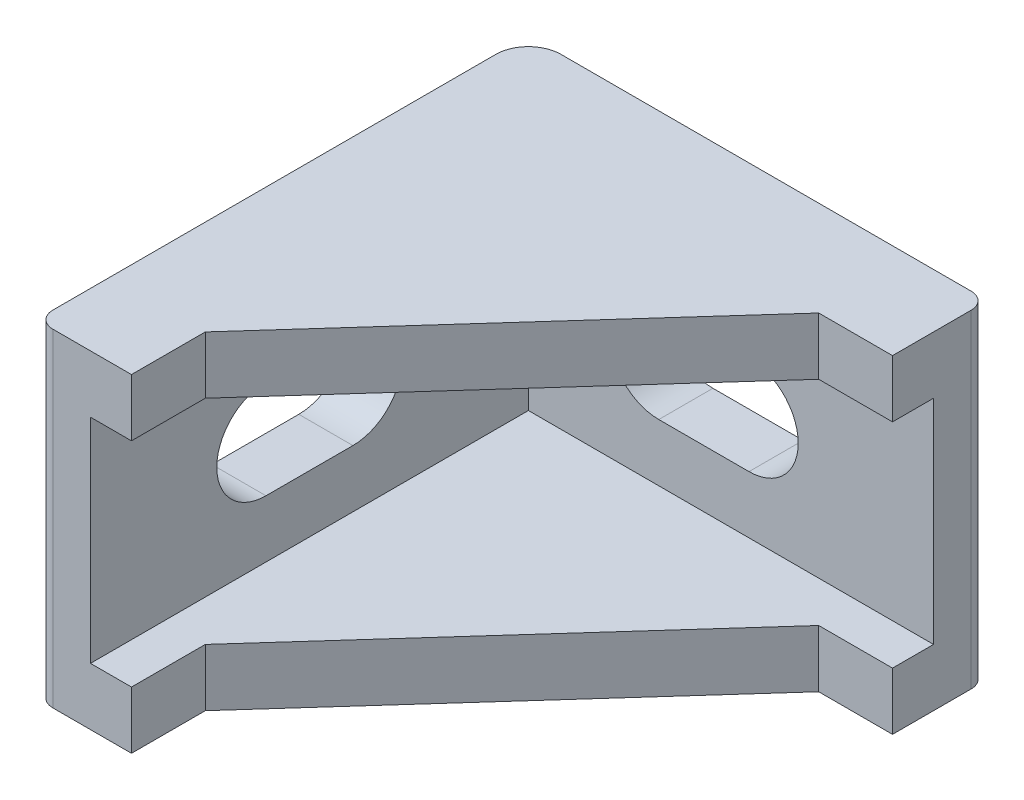
ISO-10303-21;
HEADER;
FILE_DESCRIPTION(('STEP AP214'),'2;1');
FILE_NAME('part.step','',(''),(''),'','','');
FILE_SCHEMA(('AUTOMOTIVE_DESIGN { 1 0 10303 214 1 1 1 1 }'));
ENDSEC;
DATA;
#1=APPLICATION_CONTEXT('core data for automotive mechanical design processes');
#2=APPLICATION_PROTOCOL_DEFINITION('international standard','automotive_design',2000,#1);
#3=PRODUCT_CONTEXT('',#1,'mechanical');
#4=PRODUCT('Part','Part','',(#3));
#5=PRODUCT_RELATED_PRODUCT_CATEGORY('part','',(#4));
#6=PRODUCT_DEFINITION_FORMATION('','',#4);
#7=PRODUCT_DEFINITION_CONTEXT('part definition',#1,'design');
#8=PRODUCT_DEFINITION('design','',#6,#7);
#9=PRODUCT_DEFINITION_SHAPE('','',#8);
#10=(LENGTH_UNIT() NAMED_UNIT(*) SI_UNIT(.MILLI.,.METRE.));
#11=(NAMED_UNIT(*) PLANE_ANGLE_UNIT() SI_UNIT($,.RADIAN.));
#12=(NAMED_UNIT(*) SI_UNIT($,.STERADIAN.) SOLID_ANGLE_UNIT());
#13=UNCERTAINTY_MEASURE_WITH_UNIT(LENGTH_MEASURE(1.E-05),#10,'distance_accuracy_value','');
#14=(GEOMETRIC_REPRESENTATION_CONTEXT(3) GLOBAL_UNCERTAINTY_ASSIGNED_CONTEXT((#13)) GLOBAL_UNIT_ASSIGNED_CONTEXT((#10,
#11,#12)) REPRESENTATION_CONTEXT('',''));
#15=CARTESIAN_POINT('',(0.,0.,0.));
#16=DIRECTION('',(0.,0.,1.));
#17=DIRECTION('',(1.,0.,0.));
#18=AXIS2_PLACEMENT_3D('',#15,#16,#17);
#19=CARTESIAN_POINT('',(0.,0.,3.3));
#20=DIRECTION('',(0.,0.,-1.));
#21=DIRECTION('',(-1.,0.,0.));
#22=AXIS2_PLACEMENT_3D('',#19,#20,#21);
#23=PLANE('',#22);
#24=CARTESIAN_POINT('',(11.25,10.,3.3));
#25=DIRECTION('',(0.,0.,1.));
#26=DIRECTION('',(1.,0.,0.));
#27=AXIS2_PLACEMENT_3D('',#24,#25,#26);
#28=CIRCLE('',#27,3.);
#29=CARTESIAN_POINT('',(11.25,13.,3.3));
#30=VERTEX_POINT('',#29);
#31=CARTESIAN_POINT('',(11.25,7.,3.3));
#32=VERTEX_POINT('',#31);
#33=EDGE_CURVE('E253',#30,#32,#28,.T.);
#34=ORIENTED_EDGE('',*,*,#33,.F.);
#35=DIRECTION('',(-1.,0.,0.));
#36=VECTOR('',#35,1.);
#37=CARTESIAN_POINT('',(11.25,13.,3.3));
#38=LINE('',#37,#36);
#39=CARTESIAN_POINT('',(16.75,13.,3.3));
#40=VERTEX_POINT('',#39);
#41=EDGE_CURVE('E264',#40,#30,#38,.T.);
#42=ORIENTED_EDGE('',*,*,#41,.F.);
#43=CARTESIAN_POINT('',(16.75,10.,3.3));
#44=DIRECTION('',(0.,0.,1.));
#45=DIRECTION('',(1.,0.,0.));
#46=AXIS2_PLACEMENT_3D('',#43,#44,#45);
#47=CIRCLE('',#46,3.);
#48=CARTESIAN_POINT('',(16.75,7.,3.3));
#49=VERTEX_POINT('',#48);
#50=EDGE_CURVE('E260',#49,#40,#47,.T.);
#51=ORIENTED_EDGE('',*,*,#50,.F.);
#52=DIRECTION('',(1.,0.,0.));
#53=VECTOR('',#52,1.);
#54=CARTESIAN_POINT('',(11.25,7.,3.3));
#55=LINE('',#54,#53);
#56=EDGE_CURVE('E256',#32,#49,#55,.T.);
#57=ORIENTED_EDGE('',*,*,#56,.F.);
#58=EDGE_LOOP('',(#34,#42,#51,#57));
#59=FACE_BOUND('',#58,.T.);
#60=DIRECTION('',(0.,1.,0.));
#61=VECTOR('',#60,1.);
#62=CARTESIAN_POINT('',(28.,0.,3.3));
#63=LINE('',#62,#61);
#64=CARTESIAN_POINT('',(28.,3.5,3.3));
#65=VERTEX_POINT('',#64);
#66=CARTESIAN_POINT('',(28.,16.5,3.3));
#67=VERTEX_POINT('',#66);
#68=EDGE_CURVE('E231',#65,#67,#63,.T.);
#69=ORIENTED_EDGE('',*,*,#68,.T.);
#70=DIRECTION('',(-1.,0.,0.));
#71=VECTOR('',#70,1.);
#72=CARTESIAN_POINT('',(3.29999999999999,16.5,3.3));
#73=LINE('',#72,#71);
#74=CARTESIAN_POINT('',(3.29999999999999,16.5,3.3));
#75=VERTEX_POINT('',#74);
#76=EDGE_CURVE('E214',#67,#75,#73,.T.);
#77=ORIENTED_EDGE('',*,*,#76,.T.);
#78=DIRECTION('',(0.,1.,0.));
#79=VECTOR('',#78,1.);
#80=CARTESIAN_POINT('',(3.29999999999999,20.,3.3));
#81=LINE('',#80,#79);
#82=CARTESIAN_POINT('',(3.29999999999999,3.5,3.3));
#83=VERTEX_POINT('',#82);
#84=EDGE_CURVE('E229',#83,#75,#81,.T.);
#85=ORIENTED_EDGE('',*,*,#84,.F.);
#86=DIRECTION('',(1.,0.,0.));
#87=VECTOR('',#86,1.);
#88=CARTESIAN_POINT('',(3.29999999999999,3.5,3.3));
#89=LINE('',#88,#87);
#90=EDGE_CURVE('E442',#83,#65,#89,.T.);
#91=ORIENTED_EDGE('',*,*,#90,.T.);
#92=EDGE_LOOP('',(#69,#77,#85,#91));
#93=FACE_BOUND('',#92,.T.);
#94=ADVANCED_FACE('F44',(#59,#93),#23,.F.);
#95=CARTESIAN_POINT('',(3.29999999999999,20.,30.));
#96=DIRECTION('',(-1.,0.,0.));
#97=DIRECTION('',(0.,-1.,0.));
#98=AXIS2_PLACEMENT_3D('',#95,#96,#97);
#99=PLANE('',#98);
#100=DIRECTION('',(0.,0.,-1.));
#101=VECTOR('',#100,1.);
#102=CARTESIAN_POINT('',(3.29999999999999,7.,19.3));
#103=LINE('',#102,#101);
#104=CARTESIAN_POINT('',(3.29999999999999,7.,19.3));
#105=VERTEX_POINT('',#104);
#106=CARTESIAN_POINT('',(3.29999999999999,7.,14.));
#107=VERTEX_POINT('',#106);
#108=EDGE_CURVE('E375',#105,#107,#103,.T.);
#109=ORIENTED_EDGE('',*,*,#108,.F.);
#110=CARTESIAN_POINT('',(3.29999999999999,10.,19.3));
#111=DIRECTION('',(1.,0.,0.));
#112=DIRECTION('',(0.,1.,0.));
#113=AXIS2_PLACEMENT_3D('',#110,#111,#112);
#114=CIRCLE('',#113,3.);
#115=CARTESIAN_POINT('',(3.29999999999999,13.,19.3));
#116=VERTEX_POINT('',#115);
#117=EDGE_CURVE('E379',#116,#105,#114,.T.);
#118=ORIENTED_EDGE('',*,*,#117,.F.);
#119=DIRECTION('',(0.,0.,1.));
#120=VECTOR('',#119,1.);
#121=CARTESIAN_POINT('',(3.29999999999999,13.,19.3));
#122=LINE('',#121,#120);
#123=CARTESIAN_POINT('',(3.29999999999999,13.,14.));
#124=VERTEX_POINT('',#123);
#125=EDGE_CURVE('E366',#124,#116,#122,.T.);
#126=ORIENTED_EDGE('',*,*,#125,.F.);
#127=CARTESIAN_POINT('',(3.29999999999999,10.,14.));
#128=DIRECTION('',(1.,0.,0.));
#129=DIRECTION('',(0.,1.,0.));
#130=AXIS2_PLACEMENT_3D('',#127,#128,#129);
#131=CIRCLE('',#130,3.);
#132=EDGE_CURVE('E371',#107,#124,#131,.T.);
#133=ORIENTED_EDGE('',*,*,#132,.F.);
#134=EDGE_LOOP('',(#109,#118,#126,#133));
#135=FACE_BOUND('',#134,.T.);
#136=ORIENTED_EDGE('',*,*,#84,.T.);
#137=DIRECTION('',(0.,0.,1.));
#138=VECTOR('',#137,1.);
#139=CARTESIAN_POINT('',(3.29999999999999,16.5,30.));
#140=LINE('',#139,#138);
#141=CARTESIAN_POINT('',(3.29999999999999,16.5,30.));
#142=VERTEX_POINT('',#141);
#143=EDGE_CURVE('E210',#75,#142,#140,.T.);
#144=ORIENTED_EDGE('',*,*,#143,.T.);
#145=DIRECTION('',(0.,1.,0.));
#146=VECTOR('',#145,1.);
#147=CARTESIAN_POINT('',(3.29999999999999,20.,30.));
#148=LINE('',#147,#146);
#149=CARTESIAN_POINT('',(3.3,3.5,30.));
#150=VERTEX_POINT('',#149);
#151=EDGE_CURVE('E245',#150,#142,#148,.T.);
#152=ORIENTED_EDGE('',*,*,#151,.F.);
#153=DIRECTION('',(0.,0.,-1.));
#154=VECTOR('',#153,1.);
#155=CARTESIAN_POINT('',(3.3,3.5,30.));
#156=LINE('',#155,#154);
#157=EDGE_CURVE('E238',#150,#83,#156,.T.);
#158=ORIENTED_EDGE('',*,*,#157,.T.);
#159=EDGE_LOOP('',(#136,#144,#152,#158));
#160=FACE_BOUND('',#159,.T.);
#161=ADVANCED_FACE('F236',(#135,#160),#99,.F.);
#162=CARTESIAN_POINT('',(0.,0.,0.));
#163=DIRECTION('',(0.,0.,-1.));
#164=DIRECTION('',(-1.,0.,0.));
#165=AXIS2_PLACEMENT_3D('',#162,#163,#164);
#166=PLANE('',#165);
#167=DIRECTION('',(-1.,0.,0.));
#168=VECTOR('',#167,1.);
#169=CARTESIAN_POINT('',(0.,20.,0.));
#170=LINE('',#169,#168);
#171=CARTESIAN_POINT('',(27.,20.,0.));
#172=VERTEX_POINT('',#171);
#173=CARTESIAN_POINT('',(1.99999999999999,20.,0.));
#174=VERTEX_POINT('',#173);
#175=EDGE_CURVE('E300',#172,#174,#170,.T.);
#176=ORIENTED_EDGE('',*,*,#175,.F.);
#177=DIRECTION('',(0.,1.,0.));
#178=VECTOR('',#177,1.);
#179=CARTESIAN_POINT('',(27.,0.,0.));
#180=LINE('',#179,#178);
#181=CARTESIAN_POINT('',(27.,0.,0.));
#182=VERTEX_POINT('',#181);
#183=EDGE_CURVE('E53',#172,#182,#180,.F.);
#184=ORIENTED_EDGE('',*,*,#183,.T.);
#185=DIRECTION('',(1.,0.,0.));
#186=VECTOR('',#185,1.);
#187=CARTESIAN_POINT('',(0.,0.,0.));
#188=LINE('',#187,#186);
#189=CARTESIAN_POINT('',(2.,0.,0.));
#190=VERTEX_POINT('',#189);
#191=EDGE_CURVE('E296',#190,#182,#188,.T.);
#192=ORIENTED_EDGE('',*,*,#191,.F.);
#193=DIRECTION('',(0.,-1.,0.));
#194=VECTOR('',#193,1.);
#195=CARTESIAN_POINT('',(1.99999999999999,20.,0.));
#196=LINE('',#195,#194);
#197=EDGE_CURVE('E324',#190,#174,#196,.F.);
#198=ORIENTED_EDGE('',*,*,#197,.T.);
#199=EDGE_LOOP('',(#176,#184,#192,#198));
#200=FACE_BOUND('',#199,.T.);
#201=DIRECTION('',(-1.,0.,0.));
#202=VECTOR('',#201,1.);
#203=CARTESIAN_POINT('',(11.25,13.,0.));
#204=LINE('',#203,#202);
#205=CARTESIAN_POINT('',(16.75,13.,0.));
#206=VERTEX_POINT('',#205);
#207=CARTESIAN_POINT('',(11.25,13.,0.));
#208=VERTEX_POINT('',#207);
#209=EDGE_CURVE('E257',#206,#208,#204,.T.);
#210=ORIENTED_EDGE('',*,*,#209,.T.);
#211=CARTESIAN_POINT('',(11.25,10.,0.));
#212=DIRECTION('',(0.,0.,1.));
#213=DIRECTION('',(1.,0.,0.));
#214=AXIS2_PLACEMENT_3D('',#211,#212,#213);
#215=CIRCLE('',#214,3.);
#216=CARTESIAN_POINT('',(11.25,7.,0.));
#217=VERTEX_POINT('',#216);
#218=EDGE_CURVE('E268',#208,#217,#215,.T.);
#219=ORIENTED_EDGE('',*,*,#218,.T.);
#220=DIRECTION('',(1.,0.,0.));
#221=VECTOR('',#220,1.);
#222=CARTESIAN_POINT('',(11.25,7.,0.));
#223=LINE('',#222,#221);
#224=CARTESIAN_POINT('',(16.75,7.,0.));
#225=VERTEX_POINT('',#224);
#226=EDGE_CURVE('E272',#217,#225,#223,.T.);
#227=ORIENTED_EDGE('',*,*,#226,.T.);
#228=CARTESIAN_POINT('',(16.75,10.,0.));
#229=DIRECTION('',(0.,0.,1.));
#230=DIRECTION('',(1.,0.,0.));
#231=AXIS2_PLACEMENT_3D('',#228,#229,#230);
#232=CIRCLE('',#231,3.);
#233=EDGE_CURVE('E276',#225,#206,#232,.T.);
#234=ORIENTED_EDGE('',*,*,#233,.T.);
#235=EDGE_LOOP('',(#210,#219,#227,#234));
#236=FACE_BOUND('',#235,.T.);
#237=ADVANCED_FACE('F526',(#200,#236),#166,.T.);
#238=CARTESIAN_POINT('',(0.,0.,3.3));
#239=DIRECTION('',(1.,0.,0.));
#240=DIRECTION('',(0.,1.,0.));
#241=AXIS2_PLACEMENT_3D('',#238,#239,#240);
#242=PLANE('',#241);
#243=DIRECTION('',(0.,0.,1.));
#244=VECTOR('',#243,1.);
#245=CARTESIAN_POINT('',(0.,13.,19.3));
#246=LINE('',#245,#244);
#247=CARTESIAN_POINT('',(0.,13.,14.));
#248=VERTEX_POINT('',#247);
#249=CARTESIAN_POINT('',(0.,13.,19.3));
#250=VERTEX_POINT('',#249);
#251=EDGE_CURVE('E361',#248,#250,#246,.T.);
#252=ORIENTED_EDGE('',*,*,#251,.T.);
#253=CARTESIAN_POINT('',(0.,10.,19.3));
#254=DIRECTION('',(1.,0.,0.));
#255=DIRECTION('',(0.,1.,0.));
#256=AXIS2_PLACEMENT_3D('',#253,#254,#255);
#257=CIRCLE('',#256,3.);
#258=CARTESIAN_POINT('',(0.,7.,19.3));
#259=VERTEX_POINT('',#258);
#260=EDGE_CURVE('E370',#250,#259,#257,.T.);
#261=ORIENTED_EDGE('',*,*,#260,.T.);
#262=DIRECTION('',(0.,0.,-1.));
#263=VECTOR('',#262,1.);
#264=CARTESIAN_POINT('',(0.,7.,19.3));
#265=LINE('',#264,#263);
#266=CARTESIAN_POINT('',(0.,7.,14.));
#267=VERTEX_POINT('',#266);
#268=EDGE_CURVE('E390',#259,#267,#265,.T.);
#269=ORIENTED_EDGE('',*,*,#268,.T.);
#270=CARTESIAN_POINT('',(0.,10.,14.));
#271=DIRECTION('',(1.,0.,0.));
#272=DIRECTION('',(0.,1.,0.));
#273=AXIS2_PLACEMENT_3D('',#270,#271,#272);
#274=CIRCLE('',#273,3.);
#275=EDGE_CURVE('E386',#267,#248,#274,.T.);
#276=ORIENTED_EDGE('',*,*,#275,.T.);
#277=EDGE_LOOP('',(#252,#261,#269,#276));
#278=FACE_BOUND('',#277,.T.);
#279=DIRECTION('',(0.,0.,-1.));
#280=VECTOR('',#279,1.);
#281=CARTESIAN_POINT('',(0.,0.,3.3));
#282=LINE('',#281,#280);
#283=CARTESIAN_POINT('',(0.,0.,29.));
#284=VERTEX_POINT('',#283);
#285=CARTESIAN_POINT('',(0.,0.,2.));
#286=VERTEX_POINT('',#285);
#287=EDGE_CURVE('E314',#284,#286,#282,.T.);
#288=ORIENTED_EDGE('',*,*,#287,.F.);
#289=DIRECTION('',(0.,-1.,0.));
#290=VECTOR('',#289,1.);
#291=CARTESIAN_POINT('',(0.,20.,29.));
#292=LINE('',#291,#290);
#293=CARTESIAN_POINT('',(0.,20.,29.));
#294=VERTEX_POINT('',#293);
#295=EDGE_CURVE('E339',#284,#294,#292,.F.);
#296=ORIENTED_EDGE('',*,*,#295,.T.);
#297=DIRECTION('',(0.,0.,-1.));
#298=VECTOR('',#297,1.);
#299=CARTESIAN_POINT('',(0.,20.,3.3));
#300=LINE('',#299,#298);
#301=CARTESIAN_POINT('',(0.,20.,2.));
#302=VERTEX_POINT('',#301);
#303=EDGE_CURVE('E299',#294,#302,#300,.T.);
#304=ORIENTED_EDGE('',*,*,#303,.T.);
#305=DIRECTION('',(0.,-1.,0.));
#306=VECTOR('',#305,1.);
#307=CARTESIAN_POINT('',(0.,0.,2.));
#308=LINE('',#307,#306);
#309=EDGE_CURVE('E317',#302,#286,#308,.T.);
#310=ORIENTED_EDGE('',*,*,#309,.T.);
#311=EDGE_LOOP('',(#288,#296,#304,#310));
#312=FACE_BOUND('',#311,.T.);
#313=ADVANCED_FACE('F533',(#278,#312),#242,.F.);
#314=CARTESIAN_POINT('',(0.,0.,3.3));
#315=DIRECTION('',(0.,1.,0.));
#316=DIRECTION('',(0.,0.,1.));
#317=AXIS2_PLACEMENT_3D('',#314,#315,#316);
#318=PLANE('',#317);
#319=ORIENTED_EDGE('',*,*,#191,.T.);
#320=CARTESIAN_POINT('',(27.,0.,1.));
#321=DIRECTION('',(0.,1.,0.));
#322=DIRECTION('',(0.,0.,1.));
#323=AXIS2_PLACEMENT_3D('',#320,#321,#322);
#324=CIRCLE('',#323,1.);
#325=CARTESIAN_POINT('',(28.,0.,1.));
#326=VERTEX_POINT('',#325);
#327=EDGE_CURVE('E11',#182,#326,#324,.F.);
#328=ORIENTED_EDGE('',*,*,#327,.T.);
#329=DIRECTION('',(0.,0.,-1.));
#330=VECTOR('',#329,1.);
#331=CARTESIAN_POINT('',(28.,0.,3.3));
#332=LINE('',#331,#330);
#333=CARTESIAN_POINT('',(28.,0.,5.8));
#334=VERTEX_POINT('',#333);
#335=EDGE_CURVE('E310',#334,#326,#332,.T.);
#336=ORIENTED_EDGE('',*,*,#335,.F.);
#337=DIRECTION('',(-1.,0.,0.));
#338=VECTOR('',#337,1.);
#339=CARTESIAN_POINT('',(28.,0.,5.8));
#340=LINE('',#339,#338);
#341=CARTESIAN_POINT('',(23.5,0.,5.8));
#342=VERTEX_POINT('',#341);
#343=EDGE_CURVE('E419',#334,#342,#340,.T.);
#344=ORIENTED_EDGE('',*,*,#343,.T.);
#345=DIRECTION('',(-0.668338650640871,0.,0.743857142238709));
#346=VECTOR('',#345,1.);
#347=CARTESIAN_POINT('',(5.8,0.,25.5));
#348=LINE('',#347,#346);
#349=CARTESIAN_POINT('',(5.8,0.,25.5));
#350=VERTEX_POINT('',#349);
#351=EDGE_CURVE('E415',#342,#350,#348,.T.);
#352=ORIENTED_EDGE('',*,*,#351,.T.);
#353=DIRECTION('',(0.,0.,1.));
#354=VECTOR('',#353,1.);
#355=CARTESIAN_POINT('',(5.8,0.,30.));
#356=LINE('',#355,#354);
#357=CARTESIAN_POINT('',(5.8,0.,30.));
#358=VERTEX_POINT('',#357);
#359=EDGE_CURVE('E411',#350,#358,#356,.T.);
#360=ORIENTED_EDGE('',*,*,#359,.T.);
#361=DIRECTION('',(1.,0.,0.));
#362=VECTOR('',#361,1.);
#363=CARTESIAN_POINT('',(0.,0.,30.));
#364=LINE('',#363,#362);
#365=CARTESIAN_POINT('',(1.,0.,30.));
#366=VERTEX_POINT('',#365);
#367=EDGE_CURVE('E240',#366,#358,#364,.T.);
#368=ORIENTED_EDGE('',*,*,#367,.F.);
#369=CARTESIAN_POINT('',(1.,0.,29.));
#370=DIRECTION('',(0.,1.,0.));
#371=DIRECTION('',(0.,0.,1.));
#372=AXIS2_PLACEMENT_3D('',#369,#370,#371);
#373=CIRCLE('',#372,1.);
#374=EDGE_CURVE('E336',#366,#284,#373,.F.);
#375=ORIENTED_EDGE('',*,*,#374,.T.);
#376=ORIENTED_EDGE('',*,*,#287,.T.);
#377=CARTESIAN_POINT('',(2.,0.,2.));
#378=DIRECTION('',(0.,1.,0.));
#379=DIRECTION('',(0.,0.,1.));
#380=AXIS2_PLACEMENT_3D('',#377,#378,#379);
#381=CIRCLE('',#380,2.);
#382=EDGE_CURVE('E321',#286,#190,#381,.F.);
#383=ORIENTED_EDGE('',*,*,#382,.T.);
#384=EDGE_LOOP('',(#319,#328,#336,#344,#352,#360,#368,#375,#376,#383));
#385=FACE_BOUND('',#384,.T.);
#386=ADVANCED_FACE('F501',(#385),#318,.F.);
#387=CARTESIAN_POINT('',(28.,0.,3.3));
#388=DIRECTION('',(-1.,0.,0.));
#389=DIRECTION('',(0.,-1.,0.));
#390=AXIS2_PLACEMENT_3D('',#387,#388,#389);
#391=PLANE('',#390);
#392=ORIENTED_EDGE('',*,*,#335,.T.);
#393=DIRECTION('',(0.,1.,0.));
#394=VECTOR('',#393,1.);
#395=CARTESIAN_POINT('',(28.,20.,1.));
#396=LINE('',#395,#394);
#397=CARTESIAN_POINT('',(28.,20.,1.));
#398=VERTEX_POINT('',#397);
#399=EDGE_CURVE('E345',#326,#398,#396,.T.);
#400=ORIENTED_EDGE('',*,*,#399,.T.);
#401=DIRECTION('',(0.,0.,-1.));
#402=VECTOR('',#401,1.);
#403=CARTESIAN_POINT('',(28.,20.,3.3));
#404=LINE('',#403,#402);
#405=CARTESIAN_POINT('',(28.,20.,5.8));
#406=VERTEX_POINT('',#405);
#407=EDGE_CURVE('E307',#406,#398,#404,.T.);
#408=ORIENTED_EDGE('',*,*,#407,.F.);
#409=DIRECTION('',(0.,1.,0.));
#410=VECTOR('',#409,1.);
#411=CARTESIAN_POINT('',(28.,16.5,5.8));
#412=LINE('',#411,#410);
#413=CARTESIAN_POINT('',(28.,16.5,5.8));
#414=VERTEX_POINT('',#413);
#415=EDGE_CURVE('E423',#414,#406,#412,.T.);
#416=ORIENTED_EDGE('',*,*,#415,.F.);
#417=DIRECTION('',(0.,0.,-1.));
#418=VECTOR('',#417,1.);
#419=CARTESIAN_POINT('',(28.,16.5,3.3));
#420=LINE('',#419,#418);
#421=EDGE_CURVE('E452',#414,#67,#420,.T.);
#422=ORIENTED_EDGE('',*,*,#421,.T.);
#423=ORIENTED_EDGE('',*,*,#68,.F.);
#424=DIRECTION('',(0.,0.,1.));
#425=VECTOR('',#424,1.);
#426=CARTESIAN_POINT('',(28.,3.5,3.3));
#427=LINE('',#426,#425);
#428=CARTESIAN_POINT('',(28.,3.5,5.8));
#429=VERTEX_POINT('',#428);
#430=EDGE_CURVE('E438',#65,#429,#427,.T.);
#431=ORIENTED_EDGE('',*,*,#430,.T.);
#432=DIRECTION('',(0.,-1.,0.));
#433=VECTOR('',#432,1.);
#434=CARTESIAN_POINT('',(28.,3.5,5.8));
#435=LINE('',#434,#433);
#436=EDGE_CURVE('E397',#429,#334,#435,.T.);
#437=ORIENTED_EDGE('',*,*,#436,.T.);
#438=EDGE_LOOP('',(#392,#400,#408,#416,#422,#423,#431,#437));
#439=FACE_BOUND('',#438,.T.);
#440=ADVANCED_FACE('F513',(#439),#391,.F.);
#441=CARTESIAN_POINT('',(0.,20.,3.3));
#442=DIRECTION('',(0.,-1.,0.));
#443=DIRECTION('',(0.,0.,-1.));
#444=AXIS2_PLACEMENT_3D('',#441,#442,#443);
#445=PLANE('',#444);
#446=ORIENTED_EDGE('',*,*,#407,.T.);
#447=CARTESIAN_POINT('',(27.,20.,1.));
#448=DIRECTION('',(0.,-1.,0.));
#449=DIRECTION('',(0.,0.,-1.));
#450=AXIS2_PLACEMENT_3D('',#447,#448,#449);
#451=CIRCLE('',#450,1.);
#452=EDGE_CURVE('E67',#398,#172,#451,.F.);
#453=ORIENTED_EDGE('',*,*,#452,.T.);
#454=ORIENTED_EDGE('',*,*,#175,.T.);
#455=CARTESIAN_POINT('',(1.99999999999999,20.,2.));
#456=DIRECTION('',(0.,-1.,0.));
#457=DIRECTION('',(0.,0.,-1.));
#458=AXIS2_PLACEMENT_3D('',#455,#456,#457);
#459=CIRCLE('',#458,2.);
#460=EDGE_CURVE('E328',#174,#302,#459,.F.);
#461=ORIENTED_EDGE('',*,*,#460,.T.);
#462=ORIENTED_EDGE('',*,*,#303,.F.);
#463=CARTESIAN_POINT('',(0.999999999999993,20.,29.));
#464=DIRECTION('',(0.,-1.,0.));
#465=DIRECTION('',(0.,0.,-1.));
#466=AXIS2_PLACEMENT_3D('',#463,#464,#465);
#467=CIRCLE('',#466,1.);
#468=CARTESIAN_POINT('',(0.999999999999993,20.,30.));
#469=VERTEX_POINT('',#468);
#470=EDGE_CURVE('E342',#294,#469,#467,.F.);
#471=ORIENTED_EDGE('',*,*,#470,.T.);
#472=DIRECTION('',(-1.,0.,0.));
#473=VECTOR('',#472,1.);
#474=CARTESIAN_POINT('',(0.,20.,30.));
#475=LINE('',#474,#473);
#476=CARTESIAN_POINT('',(5.8,20.,30.));
#477=VERTEX_POINT('',#476);
#478=EDGE_CURVE('E251',#477,#469,#475,.T.);
#479=ORIENTED_EDGE('',*,*,#478,.F.);
#480=DIRECTION('',(0.,0.,-1.));
#481=VECTOR('',#480,1.);
#482=CARTESIAN_POINT('',(5.8,20.,25.5));
#483=LINE('',#482,#481);
#484=CARTESIAN_POINT('',(5.8,20.,25.5));
#485=VERTEX_POINT('',#484);
#486=EDGE_CURVE('E468',#477,#485,#483,.T.);
#487=ORIENTED_EDGE('',*,*,#486,.T.);
#488=DIRECTION('',(0.668338650640871,0.,-0.743857142238709));
#489=VECTOR('',#488,1.);
#490=CARTESIAN_POINT('',(23.5,20.,5.8));
#491=LINE('',#490,#489);
#492=CARTESIAN_POINT('',(23.5,20.,5.8));
#493=VERTEX_POINT('',#492);
#494=EDGE_CURVE('E464',#485,#493,#491,.T.);
#495=ORIENTED_EDGE('',*,*,#494,.T.);
#496=DIRECTION('',(1.,0.,0.));
#497=VECTOR('',#496,1.);
#498=CARTESIAN_POINT('',(28.,20.,5.8));
#499=LINE('',#498,#497);
#500=EDGE_CURVE('E233',#493,#406,#499,.T.);
#501=ORIENTED_EDGE('',*,*,#500,.T.);
#502=EDGE_LOOP('',(#446,#453,#454,#461,#462,#471,#479,#487,#495,#501));
#503=FACE_BOUND('',#502,.T.);
#504=ADVANCED_FACE('F493',(#503),#445,.F.);
#505=CARTESIAN_POINT('',(11.25,10.,3.3));
#506=DIRECTION('',(0.,0.,-1.));
#507=DIRECTION('',(-1.,0.,0.));
#508=AXIS2_PLACEMENT_3D('',#505,#506,#507);
#509=CYLINDRICAL_SURFACE('',#508,3.);
#510=ORIENTED_EDGE('',*,*,#218,.F.);
#511=DIRECTION('',(0.,0.,-1.));
#512=VECTOR('',#511,1.);
#513=CARTESIAN_POINT('',(11.25,13.,3.3));
#514=LINE('',#513,#512);
#515=EDGE_CURVE('E267',#30,#208,#514,.T.);
#516=ORIENTED_EDGE('',*,*,#515,.F.);
#517=ORIENTED_EDGE('',*,*,#33,.T.);
#518=DIRECTION('',(0.,0.,-1.));
#519=VECTOR('',#518,1.);
#520=CARTESIAN_POINT('',(11.25,7.,3.3));
#521=LINE('',#520,#519);
#522=EDGE_CURVE('E292',#32,#217,#521,.T.);
#523=ORIENTED_EDGE('',*,*,#522,.T.);
#524=EDGE_LOOP('',(#510,#516,#517,#523));
#525=FACE_BOUND('',#524,.T.);
#526=ADVANCED_FACE('F556',(#525),#509,.F.);
#527=CARTESIAN_POINT('',(11.25,7.,3.3));
#528=DIRECTION('',(0.,1.,0.));
#529=DIRECTION('',(-1.,0.,0.));
#530=AXIS2_PLACEMENT_3D('',#527,#528,#529);
#531=PLANE('',#530);
#532=ORIENTED_EDGE('',*,*,#226,.F.);
#533=ORIENTED_EDGE('',*,*,#522,.F.);
#534=ORIENTED_EDGE('',*,*,#56,.T.);
#535=DIRECTION('',(0.,0.,-1.));
#536=VECTOR('',#535,1.);
#537=CARTESIAN_POINT('',(16.75,7.,3.3));
#538=LINE('',#537,#536);
#539=EDGE_CURVE('E289',#49,#225,#538,.T.);
#540=ORIENTED_EDGE('',*,*,#539,.T.);
#541=EDGE_LOOP('',(#532,#533,#534,#540));
#542=FACE_BOUND('',#541,.T.);
#543=ADVANCED_FACE('F732',(#542),#531,.T.);
#544=CARTESIAN_POINT('',(16.75,10.,3.3));
#545=DIRECTION('',(0.,0.,-1.));
#546=DIRECTION('',(-1.,0.,0.));
#547=AXIS2_PLACEMENT_3D('',#544,#545,#546);
#548=CYLINDRICAL_SURFACE('',#547,3.);
#549=ORIENTED_EDGE('',*,*,#233,.F.);
#550=ORIENTED_EDGE('',*,*,#539,.F.);
#551=ORIENTED_EDGE('',*,*,#50,.T.);
#552=DIRECTION('',(0.,0.,-1.));
#553=VECTOR('',#552,1.);
#554=CARTESIAN_POINT('',(16.75,13.,3.3));
#555=LINE('',#554,#553);
#556=EDGE_CURVE('E286',#40,#206,#555,.T.);
#557=ORIENTED_EDGE('',*,*,#556,.T.);
#558=EDGE_LOOP('',(#549,#550,#551,#557));
#559=FACE_BOUND('',#558,.T.);
#560=ADVANCED_FACE('F722',(#559),#548,.F.);
#561=CARTESIAN_POINT('',(11.25,13.,3.3));
#562=DIRECTION('',(0.,-1.,0.));
#563=DIRECTION('',(1.,0.,0.));
#564=AXIS2_PLACEMENT_3D('',#561,#562,#563);
#565=PLANE('',#564);
#566=ORIENTED_EDGE('',*,*,#209,.F.);
#567=ORIENTED_EDGE('',*,*,#556,.F.);
#568=ORIENTED_EDGE('',*,*,#41,.T.);
#569=ORIENTED_EDGE('',*,*,#515,.T.);
#570=EDGE_LOOP('',(#566,#567,#568,#569));
#571=FACE_BOUND('',#570,.T.);
#572=ADVANCED_FACE('F712',(#571),#565,.T.);
#573=CARTESIAN_POINT('',(0.,0.,30.));
#574=DIRECTION('',(0.,0.,1.));
#575=DIRECTION('',(1.,0.,0.));
#576=AXIS2_PLACEMENT_3D('',#573,#574,#575);
#577=PLANE('',#576);
#578=ORIENTED_EDGE('',*,*,#478,.T.);
#579=DIRECTION('',(0.,-1.,0.));
#580=VECTOR('',#579,1.);
#581=CARTESIAN_POINT('',(1.,0.,30.));
#582=LINE('',#581,#580);
#583=EDGE_CURVE('E332',#469,#366,#582,.T.);
#584=ORIENTED_EDGE('',*,*,#583,.T.);
#585=ORIENTED_EDGE('',*,*,#367,.T.);
#586=DIRECTION('',(0.,-1.,0.));
#587=VECTOR('',#586,1.);
#588=CARTESIAN_POINT('',(5.8,3.5,30.));
#589=LINE('',#588,#587);
#590=CARTESIAN_POINT('',(5.8,3.5,30.));
#591=VERTEX_POINT('',#590);
#592=EDGE_CURVE('E382',#591,#358,#589,.T.);
#593=ORIENTED_EDGE('',*,*,#592,.F.);
#594=DIRECTION('',(-1.,0.,0.));
#595=VECTOR('',#594,1.);
#596=CARTESIAN_POINT('',(3.3,3.5,30.));
#597=LINE('',#596,#595);
#598=EDGE_CURVE('E402',#591,#150,#597,.T.);
#599=ORIENTED_EDGE('',*,*,#598,.T.);
#600=ORIENTED_EDGE('',*,*,#151,.T.);
#601=DIRECTION('',(1.,0.,0.));
#602=VECTOR('',#601,1.);
#603=CARTESIAN_POINT('',(5.8,16.5,30.));
#604=LINE('',#603,#602);
#605=CARTESIAN_POINT('',(5.8,16.5,30.));
#606=VERTEX_POINT('',#605);
#607=EDGE_CURVE('E218',#142,#606,#604,.T.);
#608=ORIENTED_EDGE('',*,*,#607,.T.);
#609=DIRECTION('',(0.,1.,0.));
#610=VECTOR('',#609,1.);
#611=CARTESIAN_POINT('',(5.8,16.5,30.));
#612=LINE('',#611,#610);
#613=EDGE_CURVE('E447',#606,#477,#612,.T.);
#614=ORIENTED_EDGE('',*,*,#613,.T.);
#615=EDGE_LOOP('',(#578,#584,#585,#593,#599,#600,#608,#614));
#616=FACE_BOUND('',#615,.T.);
#617=ADVANCED_FACE('F487',(#616),#577,.T.);
#618=CARTESIAN_POINT('',(0.,10.,19.3));
#619=DIRECTION('',(1.,0.,0.));
#620=DIRECTION('',(0.,1.,0.));
#621=AXIS2_PLACEMENT_3D('',#618,#619,#620);
#622=CYLINDRICAL_SURFACE('',#621,3.);
#623=ORIENTED_EDGE('',*,*,#117,.T.);
#624=DIRECTION('',(1.,0.,0.));
#625=VECTOR('',#624,1.);
#626=CARTESIAN_POINT('',(0.,7.,19.3));
#627=LINE('',#626,#625);
#628=EDGE_CURVE('E356',#259,#105,#627,.T.);
#629=ORIENTED_EDGE('',*,*,#628,.F.);
#630=ORIENTED_EDGE('',*,*,#260,.F.);
#631=DIRECTION('',(1.,0.,0.));
#632=VECTOR('',#631,1.);
#633=CARTESIAN_POINT('',(0.,13.,19.3));
#634=LINE('',#633,#632);
#635=EDGE_CURVE('E241',#250,#116,#634,.T.);
#636=ORIENTED_EDGE('',*,*,#635,.T.);
#637=EDGE_LOOP('',(#623,#629,#630,#636));
#638=FACE_BOUND('',#637,.T.);
#639=ADVANCED_FACE('F692',(#638),#622,.F.);
#640=CARTESIAN_POINT('',(0.,13.,19.3));
#641=DIRECTION('',(0.,1.,0.));
#642=DIRECTION('',(0.,0.,1.));
#643=AXIS2_PLACEMENT_3D('',#640,#641,#642);
#644=PLANE('',#643);
#645=ORIENTED_EDGE('',*,*,#125,.T.);
#646=ORIENTED_EDGE('',*,*,#635,.F.);
#647=ORIENTED_EDGE('',*,*,#251,.F.);
#648=DIRECTION('',(1.,0.,0.));
#649=VECTOR('',#648,1.);
#650=CARTESIAN_POINT('',(0.,13.,14.));
#651=LINE('',#650,#649);
#652=EDGE_CURVE('E247',#248,#124,#651,.T.);
#653=ORIENTED_EDGE('',*,*,#652,.T.);
#654=EDGE_LOOP('',(#645,#646,#647,#653));
#655=FACE_BOUND('',#654,.T.);
#656=ADVANCED_FACE('F682',(#655),#644,.F.);
#657=CARTESIAN_POINT('',(0.,10.,14.));
#658=DIRECTION('',(1.,0.,0.));
#659=DIRECTION('',(0.,1.,0.));
#660=AXIS2_PLACEMENT_3D('',#657,#658,#659);
#661=CYLINDRICAL_SURFACE('',#660,3.);
#662=ORIENTED_EDGE('',*,*,#132,.T.);
#663=ORIENTED_EDGE('',*,*,#652,.F.);
#664=ORIENTED_EDGE('',*,*,#275,.F.);
#665=DIRECTION('',(1.,0.,0.));
#666=VECTOR('',#665,1.);
#667=CARTESIAN_POINT('',(0.,7.,14.));
#668=LINE('',#667,#666);
#669=EDGE_CURVE('E360',#267,#107,#668,.T.);
#670=ORIENTED_EDGE('',*,*,#669,.T.);
#671=EDGE_LOOP('',(#662,#663,#664,#670));
#672=FACE_BOUND('',#671,.T.);
#673=ADVANCED_FACE('F672',(#672),#661,.F.);
#674=CARTESIAN_POINT('',(0.,7.,19.3));
#675=DIRECTION('',(0.,-1.,0.));
#676=DIRECTION('',(0.,0.,-1.));
#677=AXIS2_PLACEMENT_3D('',#674,#675,#676);
#678=PLANE('',#677);
#679=ORIENTED_EDGE('',*,*,#108,.T.);
#680=ORIENTED_EDGE('',*,*,#669,.F.);
#681=ORIENTED_EDGE('',*,*,#268,.F.);
#682=ORIENTED_EDGE('',*,*,#628,.T.);
#683=EDGE_LOOP('',(#679,#680,#681,#682));
#684=FACE_BOUND('',#683,.T.);
#685=ADVANCED_FACE('F663',(#684),#678,.F.);
#686=CARTESIAN_POINT('',(5.8,3.5,30.));
#687=DIRECTION('',(1.,0.,0.));
#688=DIRECTION('',(0.,0.,-1.));
#689=AXIS2_PLACEMENT_3D('',#686,#687,#688);
#690=PLANE('',#689);
#691=ORIENTED_EDGE('',*,*,#359,.F.);
#692=DIRECTION('',(0.,-1.,0.));
#693=VECTOR('',#692,1.);
#694=CARTESIAN_POINT('',(5.8,3.5,25.5));
#695=LINE('',#694,#693);
#696=CARTESIAN_POINT('',(5.8,3.5,25.5));
#697=VERTEX_POINT('',#696);
#698=EDGE_CURVE('E405',#697,#350,#695,.T.);
#699=ORIENTED_EDGE('',*,*,#698,.F.);
#700=DIRECTION('',(0.,0.,1.));
#701=VECTOR('',#700,1.);
#702=CARTESIAN_POINT('',(5.8,3.5,30.));
#703=LINE('',#702,#701);
#704=EDGE_CURVE('E426',#697,#591,#703,.T.);
#705=ORIENTED_EDGE('',*,*,#704,.T.);
#706=ORIENTED_EDGE('',*,*,#592,.T.);
#707=EDGE_LOOP('',(#691,#699,#705,#706));
#708=FACE_BOUND('',#707,.T.);
#709=ADVANCED_FACE('F506',(#708),#690,.T.);
#710=CARTESIAN_POINT('',(5.8,3.5,25.5));
#711=DIRECTION('',(0.743857142238709,0.,0.668338650640871));
#712=DIRECTION('',(0.668338650640871,0.,-0.743857142238709));
#713=AXIS2_PLACEMENT_3D('',#710,#711,#712);
#714=PLANE('',#713);
#715=ORIENTED_EDGE('',*,*,#351,.F.);
#716=DIRECTION('',(0.,-1.,0.));
#717=VECTOR('',#716,1.);
#718=CARTESIAN_POINT('',(23.5,3.5,5.8));
#719=LINE('',#718,#717);
#720=CARTESIAN_POINT('',(23.5,3.5,5.8));
#721=VERTEX_POINT('',#720);
#722=EDGE_CURVE('E401',#721,#342,#719,.T.);
#723=ORIENTED_EDGE('',*,*,#722,.F.);
#724=DIRECTION('',(-0.668338650640871,0.,0.743857142238709));
#725=VECTOR('',#724,1.);
#726=CARTESIAN_POINT('',(5.8,3.5,25.5));
#727=LINE('',#726,#725);
#728=EDGE_CURVE('E430',#721,#697,#727,.T.);
#729=ORIENTED_EDGE('',*,*,#728,.T.);
#730=ORIENTED_EDGE('',*,*,#698,.T.);
#731=EDGE_LOOP('',(#715,#723,#729,#730));
#732=FACE_BOUND('',#731,.T.);
#733=ADVANCED_FACE('F644',(#732),#714,.T.);
#734=CARTESIAN_POINT('',(28.,3.5,5.8));
#735=DIRECTION('',(0.,0.,1.));
#736=DIRECTION('',(1.,0.,0.));
#737=AXIS2_PLACEMENT_3D('',#734,#735,#736);
#738=PLANE('',#737);
#739=ORIENTED_EDGE('',*,*,#343,.F.);
#740=ORIENTED_EDGE('',*,*,#436,.F.);
#741=DIRECTION('',(-1.,0.,0.));
#742=VECTOR('',#741,1.);
#743=CARTESIAN_POINT('',(28.,3.5,5.8));
#744=LINE('',#743,#742);
#745=EDGE_CURVE('E434',#429,#721,#744,.T.);
#746=ORIENTED_EDGE('',*,*,#745,.T.);
#747=ORIENTED_EDGE('',*,*,#722,.T.);
#748=EDGE_LOOP('',(#739,#740,#746,#747));
#749=FACE_BOUND('',#748,.T.);
#750=ADVANCED_FACE('F634',(#749),#738,.T.);
#751=CARTESIAN_POINT('',(0.,3.5,0.));
#752=DIRECTION('',(0.,-1.,0.));
#753=DIRECTION('',(0.,0.,-1.));
#754=AXIS2_PLACEMENT_3D('',#751,#752,#753);
#755=PLANE('',#754);
#756=ORIENTED_EDGE('',*,*,#157,.F.);
#757=ORIENTED_EDGE('',*,*,#598,.F.);
#758=ORIENTED_EDGE('',*,*,#704,.F.);
#759=ORIENTED_EDGE('',*,*,#728,.F.);
#760=ORIENTED_EDGE('',*,*,#745,.F.);
#761=ORIENTED_EDGE('',*,*,#430,.F.);
#762=ORIENTED_EDGE('',*,*,#90,.F.);
#763=EDGE_LOOP('',(#756,#757,#758,#759,#760,#761,#762));
#764=FACE_BOUND('',#763,.T.);
#765=ADVANCED_FACE('F510',(#764),#755,.F.);
#766=CARTESIAN_POINT('',(28.,16.5,5.8));
#767=DIRECTION('',(0.,0.,1.));
#768=DIRECTION('',(1.,0.,0.));
#769=AXIS2_PLACEMENT_3D('',#766,#767,#768);
#770=PLANE('',#769);
#771=ORIENTED_EDGE('',*,*,#500,.F.);
#772=DIRECTION('',(0.,1.,0.));
#773=VECTOR('',#772,1.);
#774=CARTESIAN_POINT('',(23.5,16.5,5.8));
#775=LINE('',#774,#773);
#776=CARTESIAN_POINT('',(23.5,16.5,5.8));
#777=VERTEX_POINT('',#776);
#778=EDGE_CURVE('E455',#777,#493,#775,.T.);
#779=ORIENTED_EDGE('',*,*,#778,.F.);
#780=DIRECTION('',(1.,0.,0.));
#781=VECTOR('',#780,1.);
#782=CARTESIAN_POINT('',(28.,16.5,5.8));
#783=LINE('',#782,#781);
#784=EDGE_CURVE('E474',#777,#414,#783,.T.);
#785=ORIENTED_EDGE('',*,*,#784,.T.);
#786=ORIENTED_EDGE('',*,*,#415,.T.);
#787=EDGE_LOOP('',(#771,#779,#785,#786));
#788=FACE_BOUND('',#787,.T.);
#789=ADVANCED_FACE('F520',(#788),#770,.T.);
#790=CARTESIAN_POINT('',(23.5,16.5,5.8));
#791=DIRECTION('',(0.743857142238709,0.,0.668338650640871));
#792=DIRECTION('',(0.668338650640871,0.,-0.743857142238709));
#793=AXIS2_PLACEMENT_3D('',#790,#791,#792);
#794=PLANE('',#793);
#795=ORIENTED_EDGE('',*,*,#494,.F.);
#796=DIRECTION('',(0.,1.,0.));
#797=VECTOR('',#796,1.);
#798=CARTESIAN_POINT('',(5.8,16.5,25.5));
#799=LINE('',#798,#797);
#800=CARTESIAN_POINT('',(5.8,16.5,25.5));
#801=VERTEX_POINT('',#800);
#802=EDGE_CURVE('E451',#801,#485,#799,.T.);
#803=ORIENTED_EDGE('',*,*,#802,.F.);
#804=DIRECTION('',(0.668338650640871,0.,-0.743857142238709));
#805=VECTOR('',#804,1.);
#806=CARTESIAN_POINT('',(23.5,16.5,5.8));
#807=LINE('',#806,#805);
#808=EDGE_CURVE('E478',#801,#777,#807,.T.);
#809=ORIENTED_EDGE('',*,*,#808,.T.);
#810=ORIENTED_EDGE('',*,*,#778,.T.);
#811=EDGE_LOOP('',(#795,#803,#809,#810));
#812=FACE_BOUND('',#811,.T.);
#813=ADVANCED_FACE('F518',(#812),#794,.T.);
#814=CARTESIAN_POINT('',(5.8,16.5,25.5));
#815=DIRECTION('',(1.,0.,0.));
#816=DIRECTION('',(0.,0.,-1.));
#817=AXIS2_PLACEMENT_3D('',#814,#815,#816);
#818=PLANE('',#817);
#819=ORIENTED_EDGE('',*,*,#486,.F.);
#820=ORIENTED_EDGE('',*,*,#613,.F.);
#821=DIRECTION('',(0.,0.,-1.));
#822=VECTOR('',#821,1.);
#823=CARTESIAN_POINT('',(5.8,16.5,25.5));
#824=LINE('',#823,#822);
#825=EDGE_CURVE('E482',#606,#801,#824,.T.);
#826=ORIENTED_EDGE('',*,*,#825,.T.);
#827=ORIENTED_EDGE('',*,*,#802,.T.);
#828=EDGE_LOOP('',(#819,#820,#826,#827));
#829=FACE_BOUND('',#828,.T.);
#830=ADVANCED_FACE('F491',(#829),#818,.T.);
#831=CARTESIAN_POINT('',(0.,16.5,0.));
#832=DIRECTION('',(0.,-1.,0.));
#833=DIRECTION('',(0.,0.,-1.));
#834=AXIS2_PLACEMENT_3D('',#831,#832,#833);
#835=PLANE('',#834);
#836=ORIENTED_EDGE('',*,*,#76,.F.);
#837=ORIENTED_EDGE('',*,*,#421,.F.);
#838=ORIENTED_EDGE('',*,*,#784,.F.);
#839=ORIENTED_EDGE('',*,*,#808,.F.);
#840=ORIENTED_EDGE('',*,*,#825,.F.);
#841=ORIENTED_EDGE('',*,*,#607,.F.);
#842=ORIENTED_EDGE('',*,*,#143,.F.);
#843=EDGE_LOOP('',(#836,#837,#838,#839,#840,#841,#842));
#844=FACE_BOUND('',#843,.T.);
#845=ADVANCED_FACE('F212',(#844),#835,.T.);
#846=CARTESIAN_POINT('',(2.,0.,2.));
#847=DIRECTION('',(0.,1.,0.));
#848=DIRECTION('',(-1.,0.,0.));
#849=AXIS2_PLACEMENT_3D('',#846,#847,#848);
#850=CYLINDRICAL_SURFACE('',#849,2.);
#851=ORIENTED_EDGE('',*,*,#460,.F.);
#852=ORIENTED_EDGE('',*,*,#197,.F.);
#853=ORIENTED_EDGE('',*,*,#382,.F.);
#854=ORIENTED_EDGE('',*,*,#309,.F.);
#855=EDGE_LOOP('',(#851,#852,#853,#854));
#856=FACE_BOUND('',#855,.T.);
#857=ADVANCED_FACE('F530',(#856),#850,.T.);
#858=CARTESIAN_POINT('',(1.,0.,29.));
#859=DIRECTION('',(0.,1.,0.));
#860=DIRECTION('',(-1.,0.,0.));
#861=AXIS2_PLACEMENT_3D('',#858,#859,#860);
#862=CYLINDRICAL_SURFACE('',#861,1.);
#863=ORIENTED_EDGE('',*,*,#470,.F.);
#864=ORIENTED_EDGE('',*,*,#295,.F.);
#865=ORIENTED_EDGE('',*,*,#374,.F.);
#866=ORIENTED_EDGE('',*,*,#583,.F.);
#867=EDGE_LOOP('',(#863,#864,#865,#866));
#868=FACE_BOUND('',#867,.T.);
#869=ADVANCED_FACE('F498',(#868),#862,.T.);
#870=CARTESIAN_POINT('',(27.,0.,1.));
#871=DIRECTION('',(0.,-1.,0.));
#872=DIRECTION('',(1.,0.,0.));
#873=AXIS2_PLACEMENT_3D('',#870,#871,#872);
#874=CYLINDRICAL_SURFACE('',#873,1.);
#875=ORIENTED_EDGE('',*,*,#327,.F.);
#876=ORIENTED_EDGE('',*,*,#183,.F.);
#877=ORIENTED_EDGE('',*,*,#452,.F.);
#878=ORIENTED_EDGE('',*,*,#399,.F.);
#879=EDGE_LOOP('',(#875,#876,#877,#878));
#880=FACE_BOUND('',#879,.T.);
#881=ADVANCED_FACE('F46',(#880),#874,.T.);
#882=CLOSED_SHELL('',(#94,#161,#237,#313,#386,#440,#504,#526,#543,#560,#572,#617,#639,#656,#673,
#685,#709,#733,#750,#765,#789,#813,#830,#845,#857,#869,#881));
#883=MANIFOLD_SOLID_BREP('B2',#882);
#884=ADVANCED_BREP_SHAPE_REPRESENTATION('',(#18,#883),#14);
#885=SHAPE_DEFINITION_REPRESENTATION(#9,#884);
ENDSEC;
END-ISO-10303-21;
